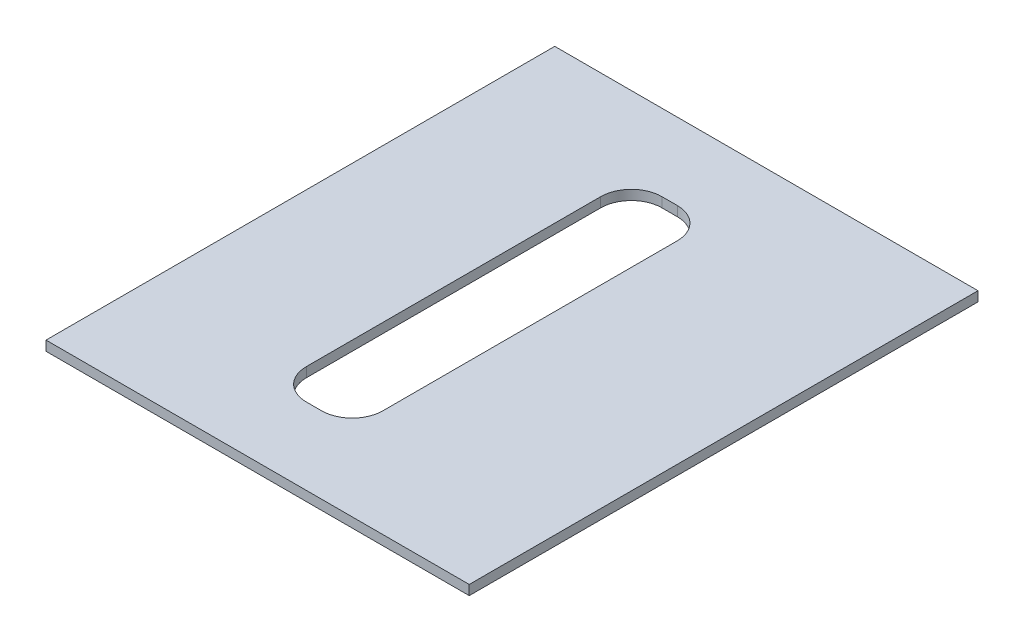
ISO-10303-21;
HEADER;
FILE_DESCRIPTION(('STEP AP214'),'2;1');
FILE_NAME('part.step','',(''),(''),'','','');
FILE_SCHEMA(('AUTOMOTIVE_DESIGN { 1 0 10303 214 1 1 1 1 }'));
ENDSEC;
DATA;
#1=APPLICATION_CONTEXT('core data for automotive mechanical design processes');
#2=APPLICATION_PROTOCOL_DEFINITION('international standard','automotive_design',2000,#1);
#3=PRODUCT_CONTEXT('',#1,'mechanical');
#4=PRODUCT('Part','Part','',(#3));
#5=PRODUCT_RELATED_PRODUCT_CATEGORY('part','',(#4));
#6=PRODUCT_DEFINITION_FORMATION('','',#4);
#7=PRODUCT_DEFINITION_CONTEXT('part definition',#1,'design');
#8=PRODUCT_DEFINITION('design','',#6,#7);
#9=PRODUCT_DEFINITION_SHAPE('','',#8);
#10=(LENGTH_UNIT() NAMED_UNIT(*) SI_UNIT(.MILLI.,.METRE.));
#11=(NAMED_UNIT(*) PLANE_ANGLE_UNIT() SI_UNIT($,.RADIAN.));
#12=(NAMED_UNIT(*) SI_UNIT($,.STERADIAN.) SOLID_ANGLE_UNIT());
#13=UNCERTAINTY_MEASURE_WITH_UNIT(LENGTH_MEASURE(1.E-05),#10,'distance_accuracy_value','');
#14=(GEOMETRIC_REPRESENTATION_CONTEXT(3) GLOBAL_UNCERTAINTY_ASSIGNED_CONTEXT((#13)) GLOBAL_UNIT_ASSIGNED_CONTEXT((#10,
#11,#12)) REPRESENTATION_CONTEXT('',''));
#15=CARTESIAN_POINT('',(0.,0.,0.));
#16=DIRECTION('',(0.,0.,1.));
#17=DIRECTION('',(1.,0.,0.));
#18=AXIS2_PLACEMENT_3D('',#15,#16,#17);
#19=CARTESIAN_POINT('',(0.,3.175,0.));
#20=DIRECTION('',(0.,-1.,0.));
#21=DIRECTION('',(0.,0.,-1.));
#22=AXIS2_PLACEMENT_3D('',#19,#20,#21);
#23=PLANE('',#22);
#24=DIRECTION('',(0.,0.,1.));
#25=VECTOR('',#24,1.);
#26=CARTESIAN_POINT('',(0.,3.175,0.));
#27=LINE('',#26,#25);
#28=CARTESIAN_POINT('',(0.,3.175,-166.124));
#29=VERTEX_POINT('',#28);
#30=CARTESIAN_POINT('',(0.,3.175,0.));
#31=VERTEX_POINT('',#30);
#32=EDGE_CURVE('E190',#29,#31,#27,.T.);
#33=ORIENTED_EDGE('',*,*,#32,.T.);
#34=DIRECTION('',(1.,0.,0.));
#35=VECTOR('',#34,1.);
#36=CARTESIAN_POINT('',(0.,3.175,0.));
#37=LINE('',#36,#35);
#38=CARTESIAN_POINT('',(138.2,3.175,0.));
#39=VERTEX_POINT('',#38);
#40=EDGE_CURVE('E193',#31,#39,#37,.T.);
#41=ORIENTED_EDGE('',*,*,#40,.T.);
#42=DIRECTION('',(0.,0.,-1.));
#43=VECTOR('',#42,1.);
#44=CARTESIAN_POINT('',(138.2,3.175,0.));
#45=LINE('',#44,#43);
#46=CARTESIAN_POINT('',(138.2,3.175,-166.124));
#47=VERTEX_POINT('',#46);
#48=EDGE_CURVE('E196',#39,#47,#45,.T.);
#49=ORIENTED_EDGE('',*,*,#48,.T.);
#50=DIRECTION('',(-1.,0.,0.));
#51=VECTOR('',#50,1.);
#52=CARTESIAN_POINT('',(0.,3.175,-166.124));
#53=LINE('',#52,#51);
#54=EDGE_CURVE('E198',#47,#29,#53,.T.);
#55=ORIENTED_EDGE('',*,*,#54,.T.);
#56=EDGE_LOOP('',(#33,#41,#49,#55));
#57=FACE_BOUND('',#56,.T.);
#58=CARTESIAN_POINT('',(60.,3.175,-35.));
#59=DIRECTION('',(0.,1.,0.));
#60=DIRECTION('',(0.,0.,1.));
#61=AXIS2_PLACEMENT_3D('',#58,#59,#60);
#62=CIRCLE('',#61,10.);
#63=CARTESIAN_POINT('',(50.,3.175,-35.0000000000001));
#64=VERTEX_POINT('',#63);
#65=CARTESIAN_POINT('',(60.0000000000001,3.175,-25.));
#66=VERTEX_POINT('',#65);
#67=EDGE_CURVE('E125',#64,#66,#62,.T.);
#68=ORIENTED_EDGE('',*,*,#67,.F.);
#69=DIRECTION('',(0.,0.,1.));
#70=VECTOR('',#69,1.);
#71=CARTESIAN_POINT('',(50.,3.175,-131.124));
#72=LINE('',#71,#70);
#73=CARTESIAN_POINT('',(50.,3.175,-131.124));
#74=VERTEX_POINT('',#73);
#75=EDGE_CURVE('E158',#74,#64,#72,.T.);
#76=ORIENTED_EDGE('',*,*,#75,.F.);
#77=CARTESIAN_POINT('',(60.,3.175,-131.124));
#78=DIRECTION('',(0.,1.,0.));
#79=DIRECTION('',(0.,0.,1.));
#80=AXIS2_PLACEMENT_3D('',#77,#78,#79);
#81=CIRCLE('',#80,10.);
#82=CARTESIAN_POINT('',(60.,3.175,-141.124));
#83=VERTEX_POINT('',#82);
#84=EDGE_CURVE('E156',#83,#74,#81,.T.);
#85=ORIENTED_EDGE('',*,*,#84,.F.);
#86=DIRECTION('',(-1.,0.,0.));
#87=VECTOR('',#86,1.);
#88=CARTESIAN_POINT('',(60.,3.175,-141.124));
#89=LINE('',#88,#87);
#90=CARTESIAN_POINT('',(65.,3.175,-141.124));
#91=VERTEX_POINT('',#90);
#92=EDGE_CURVE('E154',#91,#83,#89,.T.);
#93=ORIENTED_EDGE('',*,*,#92,.F.);
#94=CARTESIAN_POINT('',(65.,3.175,-131.124));
#95=DIRECTION('',(0.,1.,0.));
#96=DIRECTION('',(0.,0.,-1.));
#97=AXIS2_PLACEMENT_3D('',#94,#95,#96);
#98=CIRCLE('',#97,10.);
#99=CARTESIAN_POINT('',(75.,3.175,-131.124));
#100=VERTEX_POINT('',#99);
#101=EDGE_CURVE('E152',#100,#91,#98,.T.);
#102=ORIENTED_EDGE('',*,*,#101,.F.);
#103=DIRECTION('',(0.,0.,-1.));
#104=VECTOR('',#103,1.);
#105=CARTESIAN_POINT('',(75.,3.175,-131.124));
#106=LINE('',#105,#104);
#107=CARTESIAN_POINT('',(75.,3.175,-35.0000000000001));
#108=VERTEX_POINT('',#107);
#109=EDGE_CURVE('E148',#108,#100,#106,.T.);
#110=ORIENTED_EDGE('',*,*,#109,.F.);
#111=CARTESIAN_POINT('',(65.,3.175,-35.));
#112=DIRECTION('',(0.,1.,0.));
#113=DIRECTION('',(0.,0.,1.));
#114=AXIS2_PLACEMENT_3D('',#111,#112,#113);
#115=CIRCLE('',#114,10.);
#116=CARTESIAN_POINT('',(65.,3.175,-25.));
#117=VERTEX_POINT('',#116);
#118=EDGE_CURVE('E146',#117,#108,#115,.T.);
#119=ORIENTED_EDGE('',*,*,#118,.F.);
#120=DIRECTION('',(1.,0.,0.));
#121=VECTOR('',#120,1.);
#122=CARTESIAN_POINT('',(60.0000000000001,3.175,-25.));
#123=LINE('',#122,#121);
#124=EDGE_CURVE('E133',#66,#117,#123,.T.);
#125=ORIENTED_EDGE('',*,*,#124,.F.);
#126=EDGE_LOOP('',(#68,#76,#85,#93,#102,#110,#119,#125));
#127=FACE_BOUND('',#126,.T.);
#128=ADVANCED_FACE('F36',(#57,#127),#23,.F.);
#129=CARTESIAN_POINT('',(0.,0.,0.));
#130=DIRECTION('',(0.,-1.,0.));
#131=DIRECTION('',(0.,0.,-1.));
#132=AXIS2_PLACEMENT_3D('',#129,#130,#131);
#133=PLANE('',#132);
#134=DIRECTION('',(0.,0.,1.));
#135=VECTOR('',#134,1.);
#136=CARTESIAN_POINT('',(0.,0.,0.));
#137=LINE('',#136,#135);
#138=CARTESIAN_POINT('',(0.,0.,-166.124));
#139=VERTEX_POINT('',#138);
#140=CARTESIAN_POINT('',(0.,0.,0.));
#141=VERTEX_POINT('',#140);
#142=EDGE_CURVE('E141',#139,#141,#137,.T.);
#143=ORIENTED_EDGE('',*,*,#142,.F.);
#144=DIRECTION('',(-1.,0.,0.));
#145=VECTOR('',#144,1.);
#146=CARTESIAN_POINT('',(0.,0.,-166.124));
#147=LINE('',#146,#145);
#148=CARTESIAN_POINT('',(138.2,0.,-166.124));
#149=VERTEX_POINT('',#148);
#150=EDGE_CURVE('E194',#149,#139,#147,.T.);
#151=ORIENTED_EDGE('',*,*,#150,.F.);
#152=DIRECTION('',(0.,0.,-1.));
#153=VECTOR('',#152,1.);
#154=CARTESIAN_POINT('',(138.2,0.,0.));
#155=LINE('',#154,#153);
#156=CARTESIAN_POINT('',(138.2,0.,0.));
#157=VERTEX_POINT('',#156);
#158=EDGE_CURVE('E205',#157,#149,#155,.T.);
#159=ORIENTED_EDGE('',*,*,#158,.F.);
#160=DIRECTION('',(1.,0.,0.));
#161=VECTOR('',#160,1.);
#162=CARTESIAN_POINT('',(0.,0.,0.));
#163=LINE('',#162,#161);
#164=EDGE_CURVE('E203',#141,#157,#163,.T.);
#165=ORIENTED_EDGE('',*,*,#164,.F.);
#166=EDGE_LOOP('',(#143,#151,#159,#165));
#167=FACE_BOUND('',#166,.T.);
#168=DIRECTION('',(0.,0.,1.));
#169=VECTOR('',#168,1.);
#170=CARTESIAN_POINT('',(50.,0.,-131.124));
#171=LINE('',#170,#169);
#172=CARTESIAN_POINT('',(50.,0.,-131.124));
#173=VERTEX_POINT('',#172);
#174=CARTESIAN_POINT('',(50.,0.,-35.0000000000001));
#175=VERTEX_POINT('',#174);
#176=EDGE_CURVE('E134',#173,#175,#171,.T.);
#177=ORIENTED_EDGE('',*,*,#176,.T.);
#178=CARTESIAN_POINT('',(60.,0.,-35.));
#179=DIRECTION('',(0.,1.,0.));
#180=DIRECTION('',(0.,0.,1.));
#181=AXIS2_PLACEMENT_3D('',#178,#179,#180);
#182=CIRCLE('',#181,10.);
#183=CARTESIAN_POINT('',(60.0000000000001,0.,-25.));
#184=VERTEX_POINT('',#183);
#185=EDGE_CURVE('E59',#175,#184,#182,.T.);
#186=ORIENTED_EDGE('',*,*,#185,.T.);
#187=DIRECTION('',(1.,0.,0.));
#188=VECTOR('',#187,1.);
#189=CARTESIAN_POINT('',(60.0000000000001,0.,-25.));
#190=LINE('',#189,#188);
#191=CARTESIAN_POINT('',(65.,0.,-25.));
#192=VERTEX_POINT('',#191);
#193=EDGE_CURVE('E140',#184,#192,#190,.T.);
#194=ORIENTED_EDGE('',*,*,#193,.T.);
#195=CARTESIAN_POINT('',(65.,0.,-35.));
#196=DIRECTION('',(0.,1.,0.));
#197=DIRECTION('',(0.,0.,1.));
#198=AXIS2_PLACEMENT_3D('',#195,#196,#197);
#199=CIRCLE('',#198,10.);
#200=CARTESIAN_POINT('',(75.,0.,-35.0000000000001));
#201=VERTEX_POINT('',#200);
#202=EDGE_CURVE('E162',#192,#201,#199,.T.);
#203=ORIENTED_EDGE('',*,*,#202,.T.);
#204=DIRECTION('',(0.,0.,-1.));
#205=VECTOR('',#204,1.);
#206=CARTESIAN_POINT('',(75.,0.,-131.124));
#207=LINE('',#206,#205);
#208=CARTESIAN_POINT('',(75.,0.,-131.124));
#209=VERTEX_POINT('',#208);
#210=EDGE_CURVE('E165',#201,#209,#207,.T.);
#211=ORIENTED_EDGE('',*,*,#210,.T.);
#212=CARTESIAN_POINT('',(65.,0.,-131.124));
#213=DIRECTION('',(0.,1.,0.));
#214=DIRECTION('',(0.,0.,-1.));
#215=AXIS2_PLACEMENT_3D('',#212,#213,#214);
#216=CIRCLE('',#215,10.);
#217=CARTESIAN_POINT('',(65.,0.,-141.124));
#218=VERTEX_POINT('',#217);
#219=EDGE_CURVE('E168',#209,#218,#216,.T.);
#220=ORIENTED_EDGE('',*,*,#219,.T.);
#221=DIRECTION('',(-1.,0.,0.));
#222=VECTOR('',#221,1.);
#223=CARTESIAN_POINT('',(60.,0.,-141.124));
#224=LINE('',#223,#222);
#225=CARTESIAN_POINT('',(60.,0.,-141.124));
#226=VERTEX_POINT('',#225);
#227=EDGE_CURVE('E171',#218,#226,#224,.T.);
#228=ORIENTED_EDGE('',*,*,#227,.T.);
#229=CARTESIAN_POINT('',(60.,0.,-131.124));
#230=DIRECTION('',(0.,1.,0.));
#231=DIRECTION('',(0.,0.,1.));
#232=AXIS2_PLACEMENT_3D('',#229,#230,#231);
#233=CIRCLE('',#232,10.);
#234=EDGE_CURVE('E174',#226,#173,#233,.T.);
#235=ORIENTED_EDGE('',*,*,#234,.T.);
#236=EDGE_LOOP('',(#177,#186,#194,#203,#211,#220,#228,#235));
#237=FACE_BOUND('',#236,.T.);
#238=ADVANCED_FACE('F223',(#167,#237),#133,.T.);
#239=CARTESIAN_POINT('',(0.,3.175,0.));
#240=DIRECTION('',(1.,0.,0.));
#241=DIRECTION('',(0.,0.,-1.));
#242=AXIS2_PLACEMENT_3D('',#239,#240,#241);
#243=PLANE('',#242);
#244=ORIENTED_EDGE('',*,*,#142,.T.);
#245=DIRECTION('',(0.,-1.,0.));
#246=VECTOR('',#245,1.);
#247=CARTESIAN_POINT('',(0.,3.175,0.));
#248=LINE('',#247,#246);
#249=EDGE_CURVE('E11',#31,#141,#248,.T.);
#250=ORIENTED_EDGE('',*,*,#249,.F.);
#251=ORIENTED_EDGE('',*,*,#32,.F.);
#252=DIRECTION('',(0.,-1.,0.));
#253=VECTOR('',#252,1.);
#254=CARTESIAN_POINT('',(0.,3.175,-166.124));
#255=LINE('',#254,#253);
#256=EDGE_CURVE('E200',#29,#139,#255,.T.);
#257=ORIENTED_EDGE('',*,*,#256,.T.);
#258=EDGE_LOOP('',(#244,#250,#251,#257));
#259=FACE_BOUND('',#258,.T.);
#260=ADVANCED_FACE('F38',(#259),#243,.F.);
#261=CARTESIAN_POINT('',(0.,3.175,0.));
#262=DIRECTION('',(0.,0.,-1.));
#263=DIRECTION('',(-1.,0.,0.));
#264=AXIS2_PLACEMENT_3D('',#261,#262,#263);
#265=PLANE('',#264);
#266=ORIENTED_EDGE('',*,*,#164,.T.);
#267=DIRECTION('',(0.,-1.,0.));
#268=VECTOR('',#267,1.);
#269=CARTESIAN_POINT('',(138.2,3.175,0.));
#270=LINE('',#269,#268);
#271=EDGE_CURVE('E44',#39,#157,#270,.T.);
#272=ORIENTED_EDGE('',*,*,#271,.F.);
#273=ORIENTED_EDGE('',*,*,#40,.F.);
#274=ORIENTED_EDGE('',*,*,#249,.T.);
#275=EDGE_LOOP('',(#266,#272,#273,#274));
#276=FACE_BOUND('',#275,.T.);
#277=ADVANCED_FACE('F233',(#276),#265,.F.);
#278=CARTESIAN_POINT('',(138.2,3.175,0.));
#279=DIRECTION('',(-1.,0.,0.));
#280=DIRECTION('',(0.,0.,1.));
#281=AXIS2_PLACEMENT_3D('',#278,#279,#280);
#282=PLANE('',#281);
#283=ORIENTED_EDGE('',*,*,#158,.T.);
#284=DIRECTION('',(0.,-1.,0.));
#285=VECTOR('',#284,1.);
#286=CARTESIAN_POINT('',(138.2,3.175,-166.124));
#287=LINE('',#286,#285);
#288=EDGE_CURVE('E210',#47,#149,#287,.T.);
#289=ORIENTED_EDGE('',*,*,#288,.F.);
#290=ORIENTED_EDGE('',*,*,#48,.F.);
#291=ORIENTED_EDGE('',*,*,#271,.T.);
#292=EDGE_LOOP('',(#283,#289,#290,#291));
#293=FACE_BOUND('',#292,.T.);
#294=ADVANCED_FACE('F217',(#293),#282,.F.);
#295=CARTESIAN_POINT('',(0.,3.175,-166.124));
#296=DIRECTION('',(0.,0.,1.));
#297=DIRECTION('',(1.,0.,0.));
#298=AXIS2_PLACEMENT_3D('',#295,#296,#297);
#299=PLANE('',#298);
#300=ORIENTED_EDGE('',*,*,#150,.T.);
#301=ORIENTED_EDGE('',*,*,#256,.F.);
#302=ORIENTED_EDGE('',*,*,#54,.F.);
#303=ORIENTED_EDGE('',*,*,#288,.T.);
#304=EDGE_LOOP('',(#300,#301,#302,#303));
#305=FACE_BOUND('',#304,.T.);
#306=ADVANCED_FACE('F227',(#305),#299,.F.);
#307=CARTESIAN_POINT('',(60.,3.175,-35.));
#308=DIRECTION('',(0.,-1.,0.));
#309=DIRECTION('',(0.,0.,-1.));
#310=AXIS2_PLACEMENT_3D('',#307,#308,#309);
#311=CYLINDRICAL_SURFACE('',#310,10.);
#312=ORIENTED_EDGE('',*,*,#185,.F.);
#313=DIRECTION('',(0.,-1.,0.));
#314=VECTOR('',#313,1.);
#315=CARTESIAN_POINT('',(50.,3.175,-35.0000000000001));
#316=LINE('',#315,#314);
#317=EDGE_CURVE('E129',#64,#175,#316,.T.);
#318=ORIENTED_EDGE('',*,*,#317,.F.);
#319=ORIENTED_EDGE('',*,*,#67,.T.);
#320=DIRECTION('',(0.,-1.,0.));
#321=VECTOR('',#320,1.);
#322=CARTESIAN_POINT('',(60.0000000000001,3.175,-25.));
#323=LINE('',#322,#321);
#324=EDGE_CURVE('E128',#66,#184,#323,.T.);
#325=ORIENTED_EDGE('',*,*,#324,.T.);
#326=EDGE_LOOP('',(#312,#318,#319,#325));
#327=FACE_BOUND('',#326,.T.);
#328=ADVANCED_FACE('F127',(#327),#311,.F.);
#329=CARTESIAN_POINT('',(60.0000000000001,3.175,-25.));
#330=DIRECTION('',(0.,0.,-1.));
#331=DIRECTION('',(-1.,0.,0.));
#332=AXIS2_PLACEMENT_3D('',#329,#330,#331);
#333=PLANE('',#332);
#334=ORIENTED_EDGE('',*,*,#193,.F.);
#335=ORIENTED_EDGE('',*,*,#324,.F.);
#336=ORIENTED_EDGE('',*,*,#124,.T.);
#337=DIRECTION('',(0.,-1.,0.));
#338=VECTOR('',#337,1.);
#339=CARTESIAN_POINT('',(65.,3.175,-25.));
#340=LINE('',#339,#338);
#341=EDGE_CURVE('E142',#117,#192,#340,.T.);
#342=ORIENTED_EDGE('',*,*,#341,.T.);
#343=EDGE_LOOP('',(#334,#335,#336,#342));
#344=FACE_BOUND('',#343,.T.);
#345=ADVANCED_FACE('F137',(#344),#333,.T.);
#346=CARTESIAN_POINT('',(65.,3.175,-35.));
#347=DIRECTION('',(0.,-1.,0.));
#348=DIRECTION('',(0.,0.,-1.));
#349=AXIS2_PLACEMENT_3D('',#346,#347,#348);
#350=CYLINDRICAL_SURFACE('',#349,10.);
#351=ORIENTED_EDGE('',*,*,#202,.F.);
#352=ORIENTED_EDGE('',*,*,#341,.F.);
#353=ORIENTED_EDGE('',*,*,#118,.T.);
#354=DIRECTION('',(0.,-1.,0.));
#355=VECTOR('',#354,1.);
#356=CARTESIAN_POINT('',(75.,3.175,-35.0000000000001));
#357=LINE('',#356,#355);
#358=EDGE_CURVE('E187',#108,#201,#357,.T.);
#359=ORIENTED_EDGE('',*,*,#358,.T.);
#360=EDGE_LOOP('',(#351,#352,#353,#359));
#361=FACE_BOUND('',#360,.T.);
#362=ADVANCED_FACE('F256',(#361),#350,.F.);
#363=CARTESIAN_POINT('',(75.,3.175,-131.124));
#364=DIRECTION('',(-1.,0.,0.));
#365=DIRECTION('',(0.,0.,1.));
#366=AXIS2_PLACEMENT_3D('',#363,#364,#365);
#367=PLANE('',#366);
#368=ORIENTED_EDGE('',*,*,#210,.F.);
#369=ORIENTED_EDGE('',*,*,#358,.F.);
#370=ORIENTED_EDGE('',*,*,#109,.T.);
#371=DIRECTION('',(0.,-1.,0.));
#372=VECTOR('',#371,1.);
#373=CARTESIAN_POINT('',(75.,3.175,-131.124));
#374=LINE('',#373,#372);
#375=EDGE_CURVE('E185',#100,#209,#374,.T.);
#376=ORIENTED_EDGE('',*,*,#375,.T.);
#377=EDGE_LOOP('',(#368,#369,#370,#376));
#378=FACE_BOUND('',#377,.T.);
#379=ADVANCED_FACE('F260',(#378),#367,.T.);
#380=CARTESIAN_POINT('',(65.,3.175,-131.124));
#381=DIRECTION('',(0.,-1.,0.));
#382=DIRECTION('',(0.,0.,-1.));
#383=AXIS2_PLACEMENT_3D('',#380,#381,#382);
#384=CYLINDRICAL_SURFACE('',#383,10.);
#385=ORIENTED_EDGE('',*,*,#219,.F.);
#386=ORIENTED_EDGE('',*,*,#375,.F.);
#387=ORIENTED_EDGE('',*,*,#101,.T.);
#388=DIRECTION('',(0.,-1.,0.));
#389=VECTOR('',#388,1.);
#390=CARTESIAN_POINT('',(65.,3.175,-141.124));
#391=LINE('',#390,#389);
#392=EDGE_CURVE('E183',#91,#218,#391,.T.);
#393=ORIENTED_EDGE('',*,*,#392,.T.);
#394=EDGE_LOOP('',(#385,#386,#387,#393));
#395=FACE_BOUND('',#394,.T.);
#396=ADVANCED_FACE('F266',(#395),#384,.F.);
#397=CARTESIAN_POINT('',(60.,3.175,-141.124));
#398=DIRECTION('',(0.,0.,1.));
#399=DIRECTION('',(1.,0.,0.));
#400=AXIS2_PLACEMENT_3D('',#397,#398,#399);
#401=PLANE('',#400);
#402=ORIENTED_EDGE('',*,*,#227,.F.);
#403=ORIENTED_EDGE('',*,*,#392,.F.);
#404=ORIENTED_EDGE('',*,*,#92,.T.);
#405=DIRECTION('',(0.,-1.,0.));
#406=VECTOR('',#405,1.);
#407=CARTESIAN_POINT('',(60.,3.175,-141.124));
#408=LINE('',#407,#406);
#409=EDGE_CURVE('E181',#83,#226,#408,.T.);
#410=ORIENTED_EDGE('',*,*,#409,.T.);
#411=EDGE_LOOP('',(#402,#403,#404,#410));
#412=FACE_BOUND('',#411,.T.);
#413=ADVANCED_FACE('F270',(#412),#401,.T.);
#414=CARTESIAN_POINT('',(60.,3.175,-131.124));
#415=DIRECTION('',(0.,-1.,0.));
#416=DIRECTION('',(0.,0.,-1.));
#417=AXIS2_PLACEMENT_3D('',#414,#415,#416);
#418=CYLINDRICAL_SURFACE('',#417,10.);
#419=ORIENTED_EDGE('',*,*,#234,.F.);
#420=ORIENTED_EDGE('',*,*,#409,.F.);
#421=ORIENTED_EDGE('',*,*,#84,.T.);
#422=DIRECTION('',(0.,-1.,0.));
#423=VECTOR('',#422,1.);
#424=CARTESIAN_POINT('',(50.,3.175,-131.124));
#425=LINE('',#424,#423);
#426=EDGE_CURVE('E51',#74,#173,#425,.T.);
#427=ORIENTED_EDGE('',*,*,#426,.T.);
#428=EDGE_LOOP('',(#419,#420,#421,#427));
#429=FACE_BOUND('',#428,.T.);
#430=ADVANCED_FACE('F274',(#429),#418,.F.);
#431=CARTESIAN_POINT('',(50.,3.175,-131.124));
#432=DIRECTION('',(1.,0.,0.));
#433=DIRECTION('',(0.,0.,-1.));
#434=AXIS2_PLACEMENT_3D('',#431,#432,#433);
#435=PLANE('',#434);
#436=ORIENTED_EDGE('',*,*,#176,.F.);
#437=ORIENTED_EDGE('',*,*,#426,.F.);
#438=ORIENTED_EDGE('',*,*,#75,.T.);
#439=ORIENTED_EDGE('',*,*,#317,.T.);
#440=EDGE_LOOP('',(#436,#437,#438,#439));
#441=FACE_BOUND('',#440,.T.);
#442=ADVANCED_FACE('F278',(#441),#435,.T.);
#443=CLOSED_SHELL('',(#128,#238,#260,#277,#294,#306,#328,#345,#362,#379,#396,#413,#430,#442));
#444=MANIFOLD_SOLID_BREP('B2',#443);
#445=ADVANCED_BREP_SHAPE_REPRESENTATION('',(#18,#444),#14);
#446=SHAPE_DEFINITION_REPRESENTATION(#9,#445);
ENDSEC;
END-ISO-10303-21;
